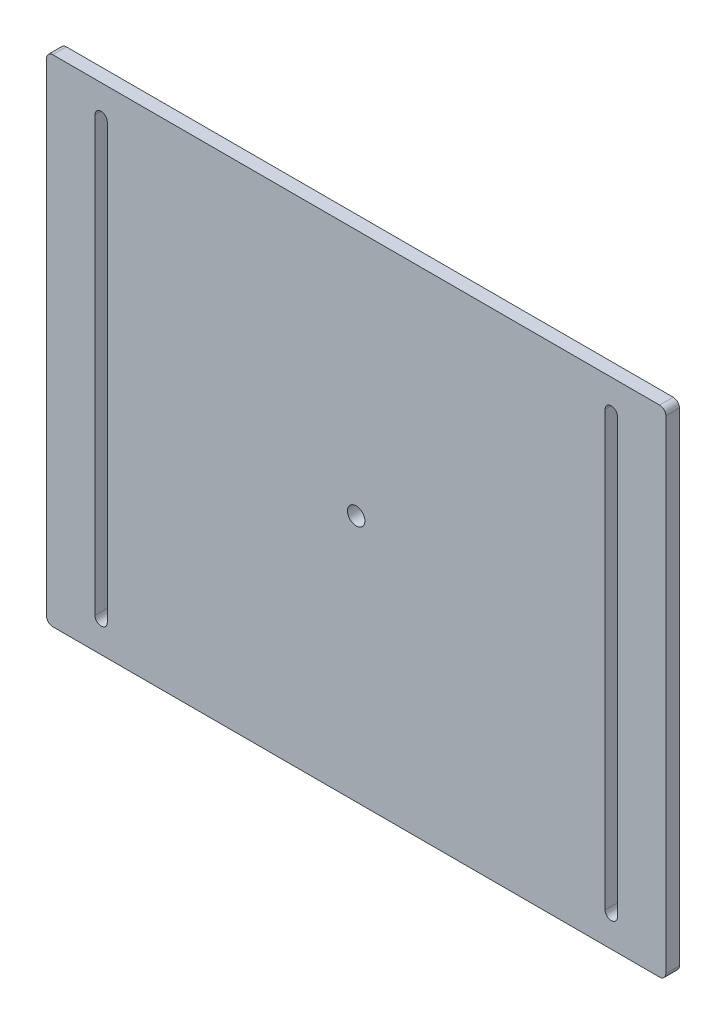
ISO-10303-21;
HEADER;
FILE_DESCRIPTION(('STEP AP214'),'2;1');
FILE_NAME('part.step','',(''),(''),'','','');
FILE_SCHEMA(('AUTOMOTIVE_DESIGN { 1 0 10303 214 1 1 1 1 }'));
ENDSEC;
DATA;
#1=APPLICATION_CONTEXT('core data for automotive mechanical design processes');
#2=APPLICATION_PROTOCOL_DEFINITION('international standard','automotive_design',2000,#1);
#3=PRODUCT_CONTEXT('',#1,'mechanical');
#4=PRODUCT('Part','Part','',(#3));
#5=PRODUCT_RELATED_PRODUCT_CATEGORY('part','',(#4));
#6=PRODUCT_DEFINITION_FORMATION('','',#4);
#7=PRODUCT_DEFINITION_CONTEXT('part definition',#1,'design');
#8=PRODUCT_DEFINITION('design','',#6,#7);
#9=PRODUCT_DEFINITION_SHAPE('','',#8);
#10=(LENGTH_UNIT() NAMED_UNIT(*) SI_UNIT(.MILLI.,.METRE.));
#11=(NAMED_UNIT(*) PLANE_ANGLE_UNIT() SI_UNIT($,.RADIAN.));
#12=(NAMED_UNIT(*) SI_UNIT($,.STERADIAN.) SOLID_ANGLE_UNIT());
#13=UNCERTAINTY_MEASURE_WITH_UNIT(LENGTH_MEASURE(1.E-05),#10,'distance_accuracy_value','');
#14=(GEOMETRIC_REPRESENTATION_CONTEXT(3) GLOBAL_UNCERTAINTY_ASSIGNED_CONTEXT((#13)) GLOBAL_UNIT_ASSIGNED_CONTEXT((#10,
#11,#12)) REPRESENTATION_CONTEXT('',''));
#15=CARTESIAN_POINT('',(0.,0.,0.));
#16=DIRECTION('',(0.,0.,1.));
#17=DIRECTION('',(1.,0.,0.));
#18=AXIS2_PLACEMENT_3D('',#15,#16,#17);
#19=CARTESIAN_POINT('',(0.,0.,5.588));
#20=DIRECTION('',(0.,0.,-1.));
#21=DIRECTION('',(-1.,0.,0.));
#22=AXIS2_PLACEMENT_3D('',#19,#20,#21);
#23=PLANE('',#22);
#24=CARTESIAN_POINT('',(0.,0.,5.588));
#25=DIRECTION('',(0.,0.,1.));
#26=DIRECTION('',(1.,0.,0.));
#27=AXIS2_PLACEMENT_3D('',#24,#25,#26);
#28=CIRCLE('',#27,3.57124);
#29=CARTESIAN_POINT('',(3.57124,0.,5.588));
#30=VERTEX_POINT('',#29);
#31=EDGE_CURVE('E489',#30,#30,#28,.T.);
#32=ORIENTED_EDGE('',*,*,#31,.F.);
#33=EDGE_LOOP('',(#32));
#34=FACE_BOUND('',#33,.T.);
#35=CARTESIAN_POINT('',(-104.619552,88.9,5.588));
#36=DIRECTION('',(0.,0.,1.));
#37=DIRECTION('',(1.,0.,0.));
#38=AXIS2_PLACEMENT_3D('',#35,#36,#37);
#39=CIRCLE('',#38,2.52729999999997);
#40=CARTESIAN_POINT('',(-102.092252,88.9,5.588));
#41=VERTEX_POINT('',#40);
#42=CARTESIAN_POINT('',(-107.146852,88.9,5.588));
#43=VERTEX_POINT('',#42);
#44=EDGE_CURVE('E191',#41,#43,#39,.T.);
#45=ORIENTED_EDGE('',*,*,#44,.F.);
#46=DIRECTION('',(0.,1.,0.));
#47=VECTOR('',#46,1.);
#48=CARTESIAN_POINT('',(-102.092252,88.9,5.588));
#49=LINE('',#48,#47);
#50=CARTESIAN_POINT('',(-102.092252,-88.9,5.588));
#51=VERTEX_POINT('',#50);
#52=EDGE_CURVE('E199',#51,#41,#49,.T.);
#53=ORIENTED_EDGE('',*,*,#52,.F.);
#54=CARTESIAN_POINT('',(-104.619552,-88.9,5.588));
#55=DIRECTION('',(0.,0.,1.));
#56=DIRECTION('',(1.,0.,0.));
#57=AXIS2_PLACEMENT_3D('',#54,#55,#56);
#58=CIRCLE('',#57,2.52729999999997);
#59=CARTESIAN_POINT('',(-107.146852,-88.9,5.588));
#60=VERTEX_POINT('',#59);
#61=EDGE_CURVE('E196',#60,#51,#58,.T.);
#62=ORIENTED_EDGE('',*,*,#61,.F.);
#63=DIRECTION('',(0.,-1.,0.));
#64=VECTOR('',#63,1.);
#65=CARTESIAN_POINT('',(-107.146852,88.9,5.588));
#66=LINE('',#65,#64);
#67=EDGE_CURVE('E193',#43,#60,#66,.T.);
#68=ORIENTED_EDGE('',*,*,#67,.F.);
#69=EDGE_LOOP('',(#45,#53,#62,#68));
#70=FACE_BOUND('',#69,.T.);
#71=DIRECTION('',(0.,-1.,0.));
#72=VECTOR('',#71,1.);
#73=CARTESIAN_POINT('',(-127.,-101.6,5.588));
#74=LINE('',#73,#72);
#75=CARTESIAN_POINT('',(-127.,99.0599999999999,5.588));
#76=VERTEX_POINT('',#75);
#77=CARTESIAN_POINT('',(-127.,-99.06,5.588));
#78=VERTEX_POINT('',#77);
#79=EDGE_CURVE('E227',#76,#78,#74,.T.);
#80=ORIENTED_EDGE('',*,*,#79,.T.);
#81=CARTESIAN_POINT('',(-124.46,-99.06,5.588));
#82=DIRECTION('',(0.,0.,-1.));
#83=DIRECTION('',(-1.,0.,0.));
#84=AXIS2_PLACEMENT_3D('',#81,#82,#83);
#85=CIRCLE('',#84,2.54);
#86=CARTESIAN_POINT('',(-124.46,-101.6,5.588));
#87=VERTEX_POINT('',#86);
#88=EDGE_CURVE('E265',#78,#87,#85,.F.);
#89=ORIENTED_EDGE('',*,*,#88,.T.);
#90=DIRECTION('',(1.,0.,0.));
#91=VECTOR('',#90,1.);
#92=CARTESIAN_POINT('',(-127.,-101.6,5.588));
#93=LINE('',#92,#91);
#94=CARTESIAN_POINT('',(124.46,-101.6,5.588));
#95=VERTEX_POINT('',#94);
#96=EDGE_CURVE('E230',#87,#95,#93,.T.);
#97=ORIENTED_EDGE('',*,*,#96,.T.);
#98=CARTESIAN_POINT('',(124.46,-99.06,5.588));
#99=DIRECTION('',(0.,0.,-1.));
#100=DIRECTION('',(-1.,0.,0.));
#101=AXIS2_PLACEMENT_3D('',#98,#99,#100);
#102=CIRCLE('',#101,2.54);
#103=CARTESIAN_POINT('',(127.,-99.06,5.588));
#104=VERTEX_POINT('',#103);
#105=EDGE_CURVE('E263',#95,#104,#102,.F.);
#106=ORIENTED_EDGE('',*,*,#105,.T.);
#107=DIRECTION('',(0.,1.,0.));
#108=VECTOR('',#107,1.);
#109=CARTESIAN_POINT('',(127.,-101.6,5.588));
#110=LINE('',#109,#108);
#111=CARTESIAN_POINT('',(127.,99.0599999999999,5.588));
#112=VERTEX_POINT('',#111);
#113=EDGE_CURVE('E222',#104,#112,#110,.T.);
#114=ORIENTED_EDGE('',*,*,#113,.T.);
#115=CARTESIAN_POINT('',(124.46,99.06,5.588));
#116=DIRECTION('',(0.,0.,-1.));
#117=DIRECTION('',(-1.,0.,0.));
#118=AXIS2_PLACEMENT_3D('',#115,#116,#117);
#119=CIRCLE('',#118,2.54);
#120=CARTESIAN_POINT('',(124.46,101.6,5.588));
#121=VERTEX_POINT('',#120);
#122=EDGE_CURVE('E54',#112,#121,#119,.F.);
#123=ORIENTED_EDGE('',*,*,#122,.T.);
#124=DIRECTION('',(-1.,0.,0.));
#125=VECTOR('',#124,1.);
#126=CARTESIAN_POINT('',(-127.,101.6,5.588));
#127=LINE('',#126,#125);
#128=CARTESIAN_POINT('',(-124.46,101.6,5.588));
#129=VERTEX_POINT('',#128);
#130=EDGE_CURVE('E224',#121,#129,#127,.T.);
#131=ORIENTED_EDGE('',*,*,#130,.T.);
#132=CARTESIAN_POINT('',(-124.46,99.06,5.588));
#133=DIRECTION('',(0.,0.,-1.));
#134=DIRECTION('',(-1.,0.,0.));
#135=AXIS2_PLACEMENT_3D('',#132,#133,#134);
#136=CIRCLE('',#135,2.54);
#137=EDGE_CURVE('E260',#129,#76,#136,.F.);
#138=ORIENTED_EDGE('',*,*,#137,.T.);
#139=EDGE_LOOP('',(#80,#89,#97,#106,#114,#123,#131,#138));
#140=FACE_BOUND('',#139,.T.);
#141=CARTESIAN_POINT('',(104.619552,88.9,5.588));
#142=DIRECTION('',(0.,0.,1.));
#143=DIRECTION('',(1.,0.,0.));
#144=AXIS2_PLACEMENT_3D('',#141,#142,#143);
#145=CIRCLE('',#144,2.5273);
#146=CARTESIAN_POINT('',(107.146852,88.9000000000001,5.588));
#147=VERTEX_POINT('',#146);
#148=CARTESIAN_POINT('',(102.092252,88.9000000000001,5.588));
#149=VERTEX_POINT('',#148);
#150=EDGE_CURVE('E148',#147,#149,#145,.T.);
#151=ORIENTED_EDGE('',*,*,#150,.F.);
#152=DIRECTION('',(0.,1.,0.));
#153=VECTOR('',#152,1.);
#154=CARTESIAN_POINT('',(107.146852,88.9000000000001,5.588));
#155=LINE('',#154,#153);
#156=CARTESIAN_POINT('',(107.146852,-88.9,5.588));
#157=VERTEX_POINT('',#156);
#158=EDGE_CURVE('E173',#157,#147,#155,.T.);
#159=ORIENTED_EDGE('',*,*,#158,.F.);
#160=CARTESIAN_POINT('',(104.619552,-88.9,5.588));
#161=DIRECTION('',(0.,0.,1.));
#162=DIRECTION('',(1.,0.,0.));
#163=AXIS2_PLACEMENT_3D('',#160,#161,#162);
#164=CIRCLE('',#163,2.5273);
#165=CARTESIAN_POINT('',(102.092252,-88.9,5.588));
#166=VERTEX_POINT('',#165);
#167=EDGE_CURVE('E171',#166,#157,#164,.T.);
#168=ORIENTED_EDGE('',*,*,#167,.F.);
#169=DIRECTION('',(0.,-1.,0.));
#170=VECTOR('',#169,1.);
#171=CARTESIAN_POINT('',(102.092252,88.9000000000001,5.588));
#172=LINE('',#171,#170);
#173=EDGE_CURVE('E158',#149,#166,#172,.T.);
#174=ORIENTED_EDGE('',*,*,#173,.F.);
#175=EDGE_LOOP('',(#151,#159,#168,#174));
#176=FACE_BOUND('',#175,.T.);
#177=ADVANCED_FACE('F33',(#34,#70,#140,#176),#23,.F.);
#178=CARTESIAN_POINT('',(0.,0.,0.));
#179=DIRECTION('',(0.,0.,-1.));
#180=DIRECTION('',(-1.,0.,0.));
#181=AXIS2_PLACEMENT_3D('',#178,#179,#180);
#182=PLANE('',#181);
#183=CARTESIAN_POINT('',(0.,0.,0.));
#184=DIRECTION('',(0.,0.,1.));
#185=DIRECTION('',(1.,0.,0.));
#186=AXIS2_PLACEMENT_3D('',#183,#184,#185);
#187=CIRCLE('',#186,3.57124);
#188=CARTESIAN_POINT('',(3.57124,0.,0.));
#189=VERTEX_POINT('',#188);
#190=EDGE_CURVE('E180',#189,#189,#187,.T.);
#191=ORIENTED_EDGE('',*,*,#190,.T.);
#192=EDGE_LOOP('',(#191));
#193=FACE_BOUND('',#192,.T.);
#194=DIRECTION('',(0.,1.,0.));
#195=VECTOR('',#194,1.);
#196=CARTESIAN_POINT('',(-102.092252,88.9,0.));
#197=LINE('',#196,#195);
#198=CARTESIAN_POINT('',(-102.092252,-88.9,0.));
#199=VERTEX_POINT('',#198);
#200=CARTESIAN_POINT('',(-102.092252,88.9,0.));
#201=VERTEX_POINT('',#200);
#202=EDGE_CURVE('E194',#199,#201,#197,.T.);
#203=ORIENTED_EDGE('',*,*,#202,.T.);
#204=CARTESIAN_POINT('',(-104.619552,88.9,0.));
#205=DIRECTION('',(0.,0.,1.));
#206=DIRECTION('',(1.,0.,0.));
#207=AXIS2_PLACEMENT_3D('',#204,#205,#206);
#208=CIRCLE('',#207,2.52729999999997);
#209=CARTESIAN_POINT('',(-107.146852,88.9,0.));
#210=VERTEX_POINT('',#209);
#211=EDGE_CURVE('E166',#201,#210,#208,.T.);
#212=ORIENTED_EDGE('',*,*,#211,.T.);
#213=DIRECTION('',(0.,-1.,0.));
#214=VECTOR('',#213,1.);
#215=CARTESIAN_POINT('',(-107.146852,88.9,0.));
#216=LINE('',#215,#214);
#217=CARTESIAN_POINT('',(-107.146852,-88.9,0.));
#218=VERTEX_POINT('',#217);
#219=EDGE_CURVE('E204',#210,#218,#216,.T.);
#220=ORIENTED_EDGE('',*,*,#219,.T.);
#221=CARTESIAN_POINT('',(-104.619552,-88.9,0.));
#222=DIRECTION('',(0.,0.,1.));
#223=DIRECTION('',(1.,0.,0.));
#224=AXIS2_PLACEMENT_3D('',#221,#222,#223);
#225=CIRCLE('',#224,2.52729999999997);
#226=EDGE_CURVE('E207',#218,#199,#225,.T.);
#227=ORIENTED_EDGE('',*,*,#226,.T.);
#228=EDGE_LOOP('',(#203,#212,#220,#227));
#229=FACE_BOUND('',#228,.T.);
#230=DIRECTION('',(1.,0.,0.));
#231=VECTOR('',#230,1.);
#232=CARTESIAN_POINT('',(-127.,-101.6,0.));
#233=LINE('',#232,#231);
#234=CARTESIAN_POINT('',(-124.46,-101.6,0.));
#235=VERTEX_POINT('',#234);
#236=CARTESIAN_POINT('',(124.46,-101.6,0.));
#237=VERTEX_POINT('',#236);
#238=EDGE_CURVE('E225',#235,#237,#233,.T.);
#239=ORIENTED_EDGE('',*,*,#238,.F.);
#240=CARTESIAN_POINT('',(-124.46,-99.06,0.));
#241=DIRECTION('',(0.,0.,-1.));
#242=DIRECTION('',(-1.,0.,0.));
#243=AXIS2_PLACEMENT_3D('',#240,#241,#242);
#244=CIRCLE('',#243,2.54);
#245=CARTESIAN_POINT('',(-127.,-99.06,0.));
#246=VERTEX_POINT('',#245);
#247=EDGE_CURVE('E253',#235,#246,#244,.T.);
#248=ORIENTED_EDGE('',*,*,#247,.T.);
#249=DIRECTION('',(0.,-1.,0.));
#250=VECTOR('',#249,1.);
#251=CARTESIAN_POINT('',(-127.,-101.6,0.));
#252=LINE('',#251,#250);
#253=CARTESIAN_POINT('',(-127.,99.0599999999999,0.));
#254=VERTEX_POINT('',#253);
#255=EDGE_CURVE('E238',#254,#246,#252,.T.);
#256=ORIENTED_EDGE('',*,*,#255,.F.);
#257=CARTESIAN_POINT('',(-124.46,99.06,0.));
#258=DIRECTION('',(0.,0.,-1.));
#259=DIRECTION('',(-1.,0.,0.));
#260=AXIS2_PLACEMENT_3D('',#257,#258,#259);
#261=CIRCLE('',#260,2.54);
#262=CARTESIAN_POINT('',(-124.46,101.6,0.));
#263=VERTEX_POINT('',#262);
#264=EDGE_CURVE('E247',#254,#263,#261,.T.);
#265=ORIENTED_EDGE('',*,*,#264,.T.);
#266=DIRECTION('',(-1.,0.,0.));
#267=VECTOR('',#266,1.);
#268=CARTESIAN_POINT('',(-127.,101.6,0.));
#269=LINE('',#268,#267);
#270=CARTESIAN_POINT('',(124.46,101.6,0.));
#271=VERTEX_POINT('',#270);
#272=EDGE_CURVE('E236',#271,#263,#269,.T.);
#273=ORIENTED_EDGE('',*,*,#272,.F.);
#274=CARTESIAN_POINT('',(124.46,99.06,0.));
#275=DIRECTION('',(0.,0.,-1.));
#276=DIRECTION('',(-1.,0.,0.));
#277=AXIS2_PLACEMENT_3D('',#274,#275,#276);
#278=CIRCLE('',#277,2.54);
#279=CARTESIAN_POINT('',(127.,99.0599999999999,0.));
#280=VERTEX_POINT('',#279);
#281=EDGE_CURVE('E249',#271,#280,#278,.T.);
#282=ORIENTED_EDGE('',*,*,#281,.T.);
#283=DIRECTION('',(0.,1.,0.));
#284=VECTOR('',#283,1.);
#285=CARTESIAN_POINT('',(127.,-101.6,0.));
#286=LINE('',#285,#284);
#287=CARTESIAN_POINT('',(127.,-99.06,0.));
#288=VERTEX_POINT('',#287);
#289=EDGE_CURVE('E221',#288,#280,#286,.T.);
#290=ORIENTED_EDGE('',*,*,#289,.F.);
#291=CARTESIAN_POINT('',(124.46,-99.06,0.));
#292=DIRECTION('',(0.,0.,-1.));
#293=DIRECTION('',(-1.,0.,0.));
#294=AXIS2_PLACEMENT_3D('',#291,#292,#293);
#295=CIRCLE('',#294,2.54);
#296=EDGE_CURVE('E251',#288,#237,#295,.T.);
#297=ORIENTED_EDGE('',*,*,#296,.T.);
#298=EDGE_LOOP('',(#239,#248,#256,#265,#273,#282,#290,#297));
#299=FACE_BOUND('',#298,.T.);
#300=DIRECTION('',(0.,1.,0.));
#301=VECTOR('',#300,1.);
#302=CARTESIAN_POINT('',(107.146852,88.9000000000001,0.));
#303=LINE('',#302,#301);
#304=CARTESIAN_POINT('',(107.146852,-88.9,0.));
#305=VERTEX_POINT('',#304);
#306=CARTESIAN_POINT('',(107.146852,88.9000000000001,0.));
#307=VERTEX_POINT('',#306);
#308=EDGE_CURVE('E159',#305,#307,#303,.T.);
#309=ORIENTED_EDGE('',*,*,#308,.T.);
#310=CARTESIAN_POINT('',(104.619552,88.9,0.));
#311=DIRECTION('',(0.,0.,1.));
#312=DIRECTION('',(1.,0.,0.));
#313=AXIS2_PLACEMENT_3D('',#310,#311,#312);
#314=CIRCLE('',#313,2.5273);
#315=CARTESIAN_POINT('',(102.092252,88.9000000000001,0.));
#316=VERTEX_POINT('',#315);
#317=EDGE_CURVE('E178',#307,#316,#314,.T.);
#318=ORIENTED_EDGE('',*,*,#317,.T.);
#319=DIRECTION('',(0.,-1.,0.));
#320=VECTOR('',#319,1.);
#321=CARTESIAN_POINT('',(102.092252,88.9000000000001,0.));
#322=LINE('',#321,#320);
#323=CARTESIAN_POINT('',(102.092252,-88.9,0.));
#324=VERTEX_POINT('',#323);
#325=EDGE_CURVE('E165',#316,#324,#322,.T.);
#326=ORIENTED_EDGE('',*,*,#325,.T.);
#327=CARTESIAN_POINT('',(104.619552,-88.9,0.));
#328=DIRECTION('',(0.,0.,1.));
#329=DIRECTION('',(1.,0.,0.));
#330=AXIS2_PLACEMENT_3D('',#327,#328,#329);
#331=CIRCLE('',#330,2.5273);
#332=EDGE_CURVE('E182',#324,#305,#331,.T.);
#333=ORIENTED_EDGE('',*,*,#332,.T.);
#334=EDGE_LOOP('',(#309,#318,#326,#333));
#335=FACE_BOUND('',#334,.T.);
#336=ADVANCED_FACE('F281',(#193,#229,#299,#335),#182,.T.);
#337=CARTESIAN_POINT('',(127.,-101.6,5.588));
#338=DIRECTION('',(-1.,0.,0.));
#339=DIRECTION('',(0.,0.,1.));
#340=AXIS2_PLACEMENT_3D('',#337,#338,#339);
#341=PLANE('',#340);
#342=ORIENTED_EDGE('',*,*,#113,.F.);
#343=DIRECTION('',(0.,0.,-1.));
#344=VECTOR('',#343,1.);
#345=CARTESIAN_POINT('',(127.,-99.06,5.588));
#346=LINE('',#345,#344);
#347=EDGE_CURVE('E269',#104,#288,#346,.T.);
#348=ORIENTED_EDGE('',*,*,#347,.T.);
#349=ORIENTED_EDGE('',*,*,#289,.T.);
#350=DIRECTION('',(0.,0.,-1.));
#351=VECTOR('',#350,1.);
#352=CARTESIAN_POINT('',(127.,99.06,5.588));
#353=LINE('',#352,#351);
#354=EDGE_CURVE('E267',#280,#112,#353,.F.);
#355=ORIENTED_EDGE('',*,*,#354,.T.);
#356=EDGE_LOOP('',(#342,#348,#349,#355));
#357=FACE_BOUND('',#356,.T.);
#358=ADVANCED_FACE('F275',(#357),#341,.F.);
#359=CARTESIAN_POINT('',(-127.,101.6,5.588));
#360=DIRECTION('',(0.,-1.,0.));
#361=DIRECTION('',(0.,0.,-1.));
#362=AXIS2_PLACEMENT_3D('',#359,#360,#361);
#363=PLANE('',#362);
#364=ORIENTED_EDGE('',*,*,#130,.F.);
#365=DIRECTION('',(0.,0.,-1.));
#366=VECTOR('',#365,1.);
#367=CARTESIAN_POINT('',(124.46,101.6,5.588));
#368=LINE('',#367,#366);
#369=EDGE_CURVE('E11',#121,#271,#368,.T.);
#370=ORIENTED_EDGE('',*,*,#369,.T.);
#371=ORIENTED_EDGE('',*,*,#272,.T.);
#372=DIRECTION('',(0.,0.,-1.));
#373=VECTOR('',#372,1.);
#374=CARTESIAN_POINT('',(-124.46,101.6,5.588));
#375=LINE('',#374,#373);
#376=EDGE_CURVE('E41',#263,#129,#375,.F.);
#377=ORIENTED_EDGE('',*,*,#376,.T.);
#378=EDGE_LOOP('',(#364,#370,#371,#377));
#379=FACE_BOUND('',#378,.T.);
#380=ADVANCED_FACE('F287',(#379),#363,.F.);
#381=CARTESIAN_POINT('',(-127.,-101.6,5.588));
#382=DIRECTION('',(1.,0.,0.));
#383=DIRECTION('',(0.,0.,-1.));
#384=AXIS2_PLACEMENT_3D('',#381,#382,#383);
#385=PLANE('',#384);
#386=ORIENTED_EDGE('',*,*,#255,.T.);
#387=DIRECTION('',(0.,0.,-1.));
#388=VECTOR('',#387,1.);
#389=CARTESIAN_POINT('',(-127.,-99.06,5.588));
#390=LINE('',#389,#388);
#391=EDGE_CURVE('E258',#246,#78,#390,.F.);
#392=ORIENTED_EDGE('',*,*,#391,.T.);
#393=ORIENTED_EDGE('',*,*,#79,.F.);
#394=DIRECTION('',(0.,0.,-1.));
#395=VECTOR('',#394,1.);
#396=CARTESIAN_POINT('',(-127.,99.06,5.588));
#397=LINE('',#396,#395);
#398=EDGE_CURVE('E255',#76,#254,#397,.T.);
#399=ORIENTED_EDGE('',*,*,#398,.T.);
#400=EDGE_LOOP('',(#386,#392,#393,#399));
#401=FACE_BOUND('',#400,.T.);
#402=ADVANCED_FACE('F294',(#401),#385,.F.);
#403=CARTESIAN_POINT('',(-127.,-101.6,5.588));
#404=DIRECTION('',(0.,1.,0.));
#405=DIRECTION('',(0.,0.,1.));
#406=AXIS2_PLACEMENT_3D('',#403,#404,#405);
#407=PLANE('',#406);
#408=ORIENTED_EDGE('',*,*,#96,.F.);
#409=DIRECTION('',(0.,0.,-1.));
#410=VECTOR('',#409,1.);
#411=CARTESIAN_POINT('',(-124.46,-101.6,5.588));
#412=LINE('',#411,#410);
#413=EDGE_CURVE('E244',#87,#235,#412,.T.);
#414=ORIENTED_EDGE('',*,*,#413,.T.);
#415=ORIENTED_EDGE('',*,*,#238,.T.);
#416=DIRECTION('',(0.,0.,-1.));
#417=VECTOR('',#416,1.);
#418=CARTESIAN_POINT('',(124.46,-101.6,5.588));
#419=LINE('',#418,#417);
#420=EDGE_CURVE('E233',#237,#95,#419,.F.);
#421=ORIENTED_EDGE('',*,*,#420,.T.);
#422=EDGE_LOOP('',(#408,#414,#415,#421));
#423=FACE_BOUND('',#422,.T.);
#424=ADVANCED_FACE('F302',(#423),#407,.F.);
#425=CARTESIAN_POINT('',(-104.619552,88.9,5.588));
#426=DIRECTION('',(0.,0.,-1.));
#427=DIRECTION('',(-1.,0.,0.));
#428=AXIS2_PLACEMENT_3D('',#425,#426,#427);
#429=CYLINDRICAL_SURFACE('',#428,2.52729999999997);
#430=ORIENTED_EDGE('',*,*,#211,.F.);
#431=DIRECTION('',(0.,0.,-1.));
#432=VECTOR('',#431,1.);
#433=CARTESIAN_POINT('',(-102.092252,88.9,5.588));
#434=LINE('',#433,#432);
#435=EDGE_CURVE('E201',#41,#201,#434,.T.);
#436=ORIENTED_EDGE('',*,*,#435,.F.);
#437=ORIENTED_EDGE('',*,*,#44,.T.);
#438=DIRECTION('',(0.,0.,-1.));
#439=VECTOR('',#438,1.);
#440=CARTESIAN_POINT('',(-107.146852,88.9,5.588));
#441=LINE('',#440,#439);
#442=EDGE_CURVE('E218',#43,#210,#441,.T.);
#443=ORIENTED_EDGE('',*,*,#442,.T.);
#444=EDGE_LOOP('',(#430,#436,#437,#443));
#445=FACE_BOUND('',#444,.T.);
#446=ADVANCED_FACE('F325',(#445),#429,.F.);
#447=CARTESIAN_POINT('',(-107.146852,88.9,5.588));
#448=DIRECTION('',(1.,0.,0.));
#449=DIRECTION('',(0.,0.,-1.));
#450=AXIS2_PLACEMENT_3D('',#447,#448,#449);
#451=PLANE('',#450);
#452=ORIENTED_EDGE('',*,*,#219,.F.);
#453=ORIENTED_EDGE('',*,*,#442,.F.);
#454=ORIENTED_EDGE('',*,*,#67,.T.);
#455=DIRECTION('',(0.,0.,-1.));
#456=VECTOR('',#455,1.);
#457=CARTESIAN_POINT('',(-107.146852,-88.9,5.588));
#458=LINE('',#457,#456);
#459=EDGE_CURVE('E216',#60,#218,#458,.T.);
#460=ORIENTED_EDGE('',*,*,#459,.T.);
#461=EDGE_LOOP('',(#452,#453,#454,#460));
#462=FACE_BOUND('',#461,.T.);
#463=ADVANCED_FACE('F424',(#462),#451,.T.);
#464=CARTESIAN_POINT('',(-104.619552,-88.9,5.588));
#465=DIRECTION('',(0.,0.,-1.));
#466=DIRECTION('',(-1.,0.,0.));
#467=AXIS2_PLACEMENT_3D('',#464,#465,#466);
#468=CYLINDRICAL_SURFACE('',#467,2.52729999999997);
#469=ORIENTED_EDGE('',*,*,#226,.F.);
#470=ORIENTED_EDGE('',*,*,#459,.F.);
#471=ORIENTED_EDGE('',*,*,#61,.T.);
#472=DIRECTION('',(0.,0.,-1.));
#473=VECTOR('',#472,1.);
#474=CARTESIAN_POINT('',(-102.092252,-88.9,5.588));
#475=LINE('',#474,#473);
#476=EDGE_CURVE('E214',#51,#199,#475,.T.);
#477=ORIENTED_EDGE('',*,*,#476,.T.);
#478=EDGE_LOOP('',(#469,#470,#471,#477));
#479=FACE_BOUND('',#478,.T.);
#480=ADVANCED_FACE('F416',(#479),#468,.F.);
#481=CARTESIAN_POINT('',(-102.092252,88.9,5.588));
#482=DIRECTION('',(-1.,0.,0.));
#483=DIRECTION('',(0.,0.,1.));
#484=AXIS2_PLACEMENT_3D('',#481,#482,#483);
#485=PLANE('',#484);
#486=ORIENTED_EDGE('',*,*,#202,.F.);
#487=ORIENTED_EDGE('',*,*,#476,.F.);
#488=ORIENTED_EDGE('',*,*,#52,.T.);
#489=ORIENTED_EDGE('',*,*,#435,.T.);
#490=EDGE_LOOP('',(#486,#487,#488,#489));
#491=FACE_BOUND('',#490,.T.);
#492=ADVANCED_FACE('F409',(#491),#485,.T.);
#493=CARTESIAN_POINT('',(104.619552,88.9,5.588));
#494=DIRECTION('',(0.,0.,-1.));
#495=DIRECTION('',(-1.,0.,0.));
#496=AXIS2_PLACEMENT_3D('',#493,#494,#495);
#497=CYLINDRICAL_SURFACE('',#496,2.5273);
#498=ORIENTED_EDGE('',*,*,#317,.F.);
#499=DIRECTION('',(0.,0.,-1.));
#500=VECTOR('',#499,1.);
#501=CARTESIAN_POINT('',(107.146852,88.9000000000001,5.588));
#502=LINE('',#501,#500);
#503=EDGE_CURVE('E154',#147,#307,#502,.T.);
#504=ORIENTED_EDGE('',*,*,#503,.F.);
#505=ORIENTED_EDGE('',*,*,#150,.T.);
#506=DIRECTION('',(0.,0.,-1.));
#507=VECTOR('',#506,1.);
#508=CARTESIAN_POINT('',(102.092252,88.9000000000001,5.588));
#509=LINE('',#508,#507);
#510=EDGE_CURVE('E151',#149,#316,#509,.T.);
#511=ORIENTED_EDGE('',*,*,#510,.T.);
#512=EDGE_LOOP('',(#498,#504,#505,#511));
#513=FACE_BOUND('',#512,.T.);
#514=ADVANCED_FACE('F150',(#513),#497,.F.);
#515=CARTESIAN_POINT('',(102.092252,88.9000000000001,5.588));
#516=DIRECTION('',(1.,0.,0.));
#517=DIRECTION('',(0.,1.,0.));
#518=AXIS2_PLACEMENT_3D('',#515,#516,#517);
#519=PLANE('',#518);
#520=ORIENTED_EDGE('',*,*,#325,.F.);
#521=ORIENTED_EDGE('',*,*,#510,.F.);
#522=ORIENTED_EDGE('',*,*,#173,.T.);
#523=DIRECTION('',(0.,0.,-1.));
#524=VECTOR('',#523,1.);
#525=CARTESIAN_POINT('',(102.092252,-88.9,5.588));
#526=LINE('',#525,#524);
#527=EDGE_CURVE('E167',#166,#324,#526,.T.);
#528=ORIENTED_EDGE('',*,*,#527,.T.);
#529=EDGE_LOOP('',(#520,#521,#522,#528));
#530=FACE_BOUND('',#529,.T.);
#531=ADVANCED_FACE('F162',(#530),#519,.T.);
#532=CARTESIAN_POINT('',(104.619552,-88.9,5.588));
#533=DIRECTION('',(0.,0.,-1.));
#534=DIRECTION('',(-1.,0.,0.));
#535=AXIS2_PLACEMENT_3D('',#532,#533,#534);
#536=CYLINDRICAL_SURFACE('',#535,2.5273);
#537=ORIENTED_EDGE('',*,*,#332,.F.);
#538=ORIENTED_EDGE('',*,*,#527,.F.);
#539=ORIENTED_EDGE('',*,*,#167,.T.);
#540=DIRECTION('',(0.,0.,-1.));
#541=VECTOR('',#540,1.);
#542=CARTESIAN_POINT('',(107.146852,-88.9,5.588));
#543=LINE('',#542,#541);
#544=EDGE_CURVE('E188',#157,#305,#543,.T.);
#545=ORIENTED_EDGE('',*,*,#544,.T.);
#546=EDGE_LOOP('',(#537,#538,#539,#545));
#547=FACE_BOUND('',#546,.T.);
#548=ADVANCED_FACE('F388',(#547),#536,.F.);
#549=CARTESIAN_POINT('',(107.146852,88.9000000000001,5.588));
#550=DIRECTION('',(-1.,0.,0.));
#551=DIRECTION('',(0.,-1.,0.));
#552=AXIS2_PLACEMENT_3D('',#549,#550,#551);
#553=PLANE('',#552);
#554=ORIENTED_EDGE('',*,*,#308,.F.);
#555=ORIENTED_EDGE('',*,*,#544,.F.);
#556=ORIENTED_EDGE('',*,*,#158,.T.);
#557=ORIENTED_EDGE('',*,*,#503,.T.);
#558=EDGE_LOOP('',(#554,#555,#556,#557));
#559=FACE_BOUND('',#558,.T.);
#560=ADVANCED_FACE('F381',(#559),#553,.T.);
#561=CARTESIAN_POINT('',(0.,0.,5.588));
#562=DIRECTION('',(0.,0.,1.));
#563=DIRECTION('',(1.,0.,0.));
#564=AXIS2_PLACEMENT_3D('',#561,#562,#563);
#565=CYLINDRICAL_SURFACE('',#564,3.57124);
#566=ORIENTED_EDGE('',*,*,#190,.F.);
#567=EDGE_LOOP('',(#566));
#568=FACE_BOUND('',#567,.T.);
#569=ORIENTED_EDGE('',*,*,#31,.T.);
#570=EDGE_LOOP('',(#569));
#571=FACE_BOUND('',#570,.T.);
#572=ADVANCED_FACE('F311',(#568,#571),#565,.F.);
#573=CARTESIAN_POINT('',(-124.46,-99.06,5.588));
#574=DIRECTION('',(0.,0.,-1.));
#575=DIRECTION('',(-1.,0.,0.));
#576=AXIS2_PLACEMENT_3D('',#573,#574,#575);
#577=CYLINDRICAL_SURFACE('',#576,2.54);
#578=ORIENTED_EDGE('',*,*,#88,.F.);
#579=ORIENTED_EDGE('',*,*,#391,.F.);
#580=ORIENTED_EDGE('',*,*,#247,.F.);
#581=ORIENTED_EDGE('',*,*,#413,.F.);
#582=EDGE_LOOP('',(#578,#579,#580,#581));
#583=FACE_BOUND('',#582,.T.);
#584=ADVANCED_FACE('F299',(#583),#577,.T.);
#585=CARTESIAN_POINT('',(124.46,-99.06,5.588));
#586=DIRECTION('',(0.,0.,-1.));
#587=DIRECTION('',(-1.,0.,0.));
#588=AXIS2_PLACEMENT_3D('',#585,#586,#587);
#589=CYLINDRICAL_SURFACE('',#588,2.54);
#590=ORIENTED_EDGE('',*,*,#105,.F.);
#591=ORIENTED_EDGE('',*,*,#420,.F.);
#592=ORIENTED_EDGE('',*,*,#296,.F.);
#593=ORIENTED_EDGE('',*,*,#347,.F.);
#594=EDGE_LOOP('',(#590,#591,#592,#593));
#595=FACE_BOUND('',#594,.T.);
#596=ADVANCED_FACE('F304',(#595),#589,.T.);
#597=CARTESIAN_POINT('',(124.46,99.06,5.588));
#598=DIRECTION('',(0.,0.,-1.));
#599=DIRECTION('',(-1.,0.,0.));
#600=AXIS2_PLACEMENT_3D('',#597,#598,#599);
#601=CYLINDRICAL_SURFACE('',#600,2.54);
#602=ORIENTED_EDGE('',*,*,#122,.F.);
#603=ORIENTED_EDGE('',*,*,#354,.F.);
#604=ORIENTED_EDGE('',*,*,#281,.F.);
#605=ORIENTED_EDGE('',*,*,#369,.F.);
#606=EDGE_LOOP('',(#602,#603,#604,#605));
#607=FACE_BOUND('',#606,.T.);
#608=ADVANCED_FACE('F286',(#607),#601,.T.);
#609=CARTESIAN_POINT('',(-124.46,99.06,5.588));
#610=DIRECTION('',(0.,0.,-1.));
#611=DIRECTION('',(-1.,0.,0.));
#612=AXIS2_PLACEMENT_3D('',#609,#610,#611);
#613=CYLINDRICAL_SURFACE('',#612,2.54);
#614=ORIENTED_EDGE('',*,*,#137,.F.);
#615=ORIENTED_EDGE('',*,*,#376,.F.);
#616=ORIENTED_EDGE('',*,*,#264,.F.);
#617=ORIENTED_EDGE('',*,*,#398,.F.);
#618=EDGE_LOOP('',(#614,#615,#616,#617));
#619=FACE_BOUND('',#618,.T.);
#620=ADVANCED_FACE('F35',(#619),#613,.T.);
#621=CLOSED_SHELL('',(#177,#336,#358,#380,#402,#424,#446,#463,#480,#492,#514,#531,#548,#560,
#572,#584,#596,#608,#620));
#622=MANIFOLD_SOLID_BREP('B2',#621);
#623=ADVANCED_BREP_SHAPE_REPRESENTATION('',(#18,#622),#14);
#624=SHAPE_DEFINITION_REPRESENTATION(#9,#623);
ENDSEC;
END-ISO-10303-21;
